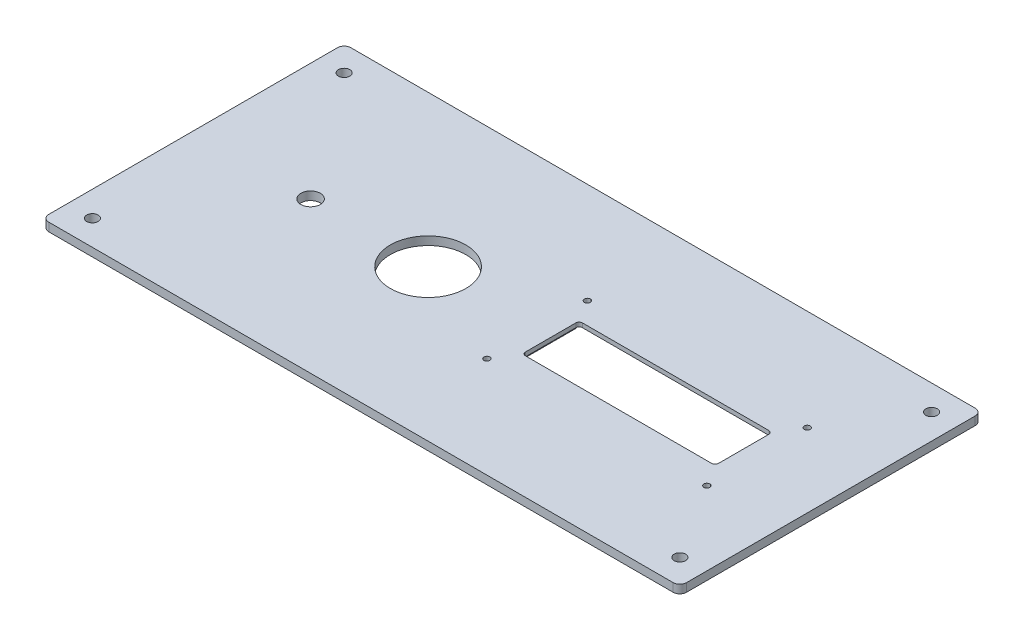
ISO-10303-21;
HEADER;
FILE_DESCRIPTION(('STEP AP214'),'2;1');
FILE_NAME('part.step','',(''),(''),'','','');
FILE_SCHEMA(('AUTOMOTIVE_DESIGN { 1 0 10303 214 1 1 1 1 }'));
ENDSEC;
DATA;
#1=APPLICATION_CONTEXT('core data for automotive mechanical design processes');
#2=APPLICATION_PROTOCOL_DEFINITION('international standard','automotive_design',2000,#1);
#3=PRODUCT_CONTEXT('',#1,'mechanical');
#4=PRODUCT('Part','Part','',(#3));
#5=PRODUCT_RELATED_PRODUCT_CATEGORY('part','',(#4));
#6=PRODUCT_DEFINITION_FORMATION('','',#4);
#7=PRODUCT_DEFINITION_CONTEXT('part definition',#1,'design');
#8=PRODUCT_DEFINITION('design','',#6,#7);
#9=PRODUCT_DEFINITION_SHAPE('','',#8);
#10=(LENGTH_UNIT() NAMED_UNIT(*) SI_UNIT(.MILLI.,.METRE.));
#11=(NAMED_UNIT(*) PLANE_ANGLE_UNIT() SI_UNIT($,.RADIAN.));
#12=(NAMED_UNIT(*) SI_UNIT($,.STERADIAN.) SOLID_ANGLE_UNIT());
#13=UNCERTAINTY_MEASURE_WITH_UNIT(LENGTH_MEASURE(1.E-05),#10,'distance_accuracy_value','');
#14=(GEOMETRIC_REPRESENTATION_CONTEXT(3) GLOBAL_UNCERTAINTY_ASSIGNED_CONTEXT((#13)) GLOBAL_UNIT_ASSIGNED_CONTEXT((#10,
#11,#12)) REPRESENTATION_CONTEXT('',''));
#15=CARTESIAN_POINT('',(0.,0.,0.));
#16=DIRECTION('',(0.,0.,1.));
#17=DIRECTION('',(1.,0.,0.));
#18=AXIS2_PLACEMENT_3D('',#15,#16,#17);
#19=CARTESIAN_POINT('',(87.63,3.175,10.795));
#20=DIRECTION('',(-1.,0.,0.));
#21=DIRECTION('',(0.,0.,1.));
#22=AXIS2_PLACEMENT_3D('',#19,#20,#21);
#23=PLANE('',#22);
#24=DIRECTION('',(0.,-1.,0.));
#25=VECTOR('',#24,1.);
#26=CARTESIAN_POINT('',(87.63,0.,-9.52500000000001));
#27=LINE('',#26,#25);
#28=CARTESIAN_POINT('',(87.63,3.175,-9.52500000000001));
#29=VERTEX_POINT('',#28);
#30=CARTESIAN_POINT('',(87.63,1.5875,-9.52500000000001));
#31=VERTEX_POINT('',#30);
#32=EDGE_CURVE('E374',#29,#31,#27,.T.);
#33=ORIENTED_EDGE('',*,*,#32,.T.);
#34=DIRECTION('',(0.,0.,-1.));
#35=VECTOR('',#34,1.);
#36=CARTESIAN_POINT('',(87.63,1.5875,0.));
#37=LINE('',#36,#35);
#38=CARTESIAN_POINT('',(87.63,1.5875,9.52499999999998));
#39=VERTEX_POINT('',#38);
#40=EDGE_CURVE('E241',#39,#31,#37,.T.);
#41=ORIENTED_EDGE('',*,*,#40,.F.);
#42=DIRECTION('',(0.,-1.,0.));
#43=VECTOR('',#42,1.);
#44=CARTESIAN_POINT('',(87.63,3.175,9.52499999999998));
#45=LINE('',#44,#43);
#46=CARTESIAN_POINT('',(87.63,3.175,9.52499999999998));
#47=VERTEX_POINT('',#46);
#48=EDGE_CURVE('E362',#39,#47,#45,.F.);
#49=ORIENTED_EDGE('',*,*,#48,.T.);
#50=DIRECTION('',(0.,0.,-1.));
#51=VECTOR('',#50,1.);
#52=CARTESIAN_POINT('',(87.63,3.175,10.795));
#53=LINE('',#52,#51);
#54=EDGE_CURVE('E298',#47,#29,#53,.T.);
#55=ORIENTED_EDGE('',*,*,#54,.T.);
#56=EDGE_LOOP('',(#33,#41,#49,#55));
#57=FACE_BOUND('',#56,.T.);
#58=ADVANCED_FACE('F33',(#57),#23,.T.);
#59=CARTESIAN_POINT('',(14.605,3.175,-10.795));
#60=DIRECTION('',(0.,0.,1.));
#61=DIRECTION('',(1.,0.,0.));
#62=AXIS2_PLACEMENT_3D('',#59,#60,#61);
#63=PLANE('',#62);
#64=DIRECTION('',(0.,-1.,0.));
#65=VECTOR('',#64,1.);
#66=CARTESIAN_POINT('',(15.875,0.,-10.795));
#67=LINE('',#66,#65);
#68=CARTESIAN_POINT('',(15.875,3.175,-10.795));
#69=VERTEX_POINT('',#68);
#70=CARTESIAN_POINT('',(15.875,1.5875,-10.795));
#71=VERTEX_POINT('',#70);
#72=EDGE_CURVE('E377',#69,#71,#67,.T.);
#73=ORIENTED_EDGE('',*,*,#72,.T.);
#74=DIRECTION('',(-1.,0.,0.));
#75=VECTOR('',#74,1.);
#76=CARTESIAN_POINT('',(0.,1.5875,-10.795));
#77=LINE('',#76,#75);
#78=CARTESIAN_POINT('',(86.36,1.5875,-10.795));
#79=VERTEX_POINT('',#78);
#80=EDGE_CURVE('E56',#79,#71,#77,.T.);
#81=ORIENTED_EDGE('',*,*,#80,.F.);
#82=DIRECTION('',(0.,-1.,0.));
#83=VECTOR('',#82,1.);
#84=CARTESIAN_POINT('',(86.36,3.175,-10.795));
#85=LINE('',#84,#83);
#86=CARTESIAN_POINT('',(86.36,3.175,-10.795));
#87=VERTEX_POINT('',#86);
#88=EDGE_CURVE('E380',#79,#87,#85,.F.);
#89=ORIENTED_EDGE('',*,*,#88,.T.);
#90=DIRECTION('',(-1.,0.,0.));
#91=VECTOR('',#90,1.);
#92=CARTESIAN_POINT('',(14.605,3.175,-10.795));
#93=LINE('',#92,#91);
#94=EDGE_CURVE('E303',#87,#69,#93,.T.);
#95=ORIENTED_EDGE('',*,*,#94,.T.);
#96=EDGE_LOOP('',(#73,#81,#89,#95));
#97=FACE_BOUND('',#96,.T.);
#98=ADVANCED_FACE('F481',(#97),#63,.T.);
#99=CARTESIAN_POINT('',(14.605,3.175,10.795));
#100=DIRECTION('',(1.,0.,0.));
#101=DIRECTION('',(0.,0.,-1.));
#102=AXIS2_PLACEMENT_3D('',#99,#100,#101);
#103=PLANE('',#102);
#104=DIRECTION('',(0.,-1.,0.));
#105=VECTOR('',#104,1.);
#106=CARTESIAN_POINT('',(14.605,0.,9.52499999999998));
#107=LINE('',#106,#105);
#108=CARTESIAN_POINT('',(14.605,3.175,9.52499999999998));
#109=VERTEX_POINT('',#108);
#110=CARTESIAN_POINT('',(14.605,1.5875,9.52499999999998));
#111=VERTEX_POINT('',#110);
#112=EDGE_CURVE('E389',#109,#111,#107,.T.);
#113=ORIENTED_EDGE('',*,*,#112,.T.);
#114=DIRECTION('',(0.,0.,1.));
#115=VECTOR('',#114,1.);
#116=CARTESIAN_POINT('',(14.605,1.5875,0.));
#117=LINE('',#116,#115);
#118=CARTESIAN_POINT('',(14.605,1.5875,-9.52500000000001));
#119=VERTEX_POINT('',#118);
#120=EDGE_CURVE('E233',#119,#111,#117,.T.);
#121=ORIENTED_EDGE('',*,*,#120,.F.);
#122=DIRECTION('',(0.,-1.,0.));
#123=VECTOR('',#122,1.);
#124=CARTESIAN_POINT('',(14.605,3.175,-9.52500000000001));
#125=LINE('',#124,#123);
#126=CARTESIAN_POINT('',(14.605,3.175,-9.52500000000001));
#127=VERTEX_POINT('',#126);
#128=EDGE_CURVE('E387',#119,#127,#125,.F.);
#129=ORIENTED_EDGE('',*,*,#128,.T.);
#130=DIRECTION('',(0.,0.,1.));
#131=VECTOR('',#130,1.);
#132=CARTESIAN_POINT('',(14.605,3.175,10.795));
#133=LINE('',#132,#131);
#134=EDGE_CURVE('E306',#127,#109,#133,.T.);
#135=ORIENTED_EDGE('',*,*,#134,.T.);
#136=EDGE_LOOP('',(#113,#121,#129,#135));
#137=FACE_BOUND('',#136,.T.);
#138=ADVANCED_FACE('F487',(#137),#103,.T.);
#139=CARTESIAN_POINT('',(14.605,3.175,10.795));
#140=DIRECTION('',(0.,0.,-1.));
#141=DIRECTION('',(-1.,0.,0.));
#142=AXIS2_PLACEMENT_3D('',#139,#140,#141);
#143=PLANE('',#142);
#144=DIRECTION('',(0.,-1.,0.));
#145=VECTOR('',#144,1.);
#146=CARTESIAN_POINT('',(86.36,0.,10.795));
#147=LINE('',#146,#145);
#148=CARTESIAN_POINT('',(86.36,3.175,10.795));
#149=VERTEX_POINT('',#148);
#150=CARTESIAN_POINT('',(86.36,1.5875,10.795));
#151=VERTEX_POINT('',#150);
#152=EDGE_CURVE('E384',#149,#151,#147,.T.);
#153=ORIENTED_EDGE('',*,*,#152,.T.);
#154=DIRECTION('',(1.,0.,0.));
#155=VECTOR('',#154,1.);
#156=CARTESIAN_POINT('',(0.,1.5875,10.795));
#157=LINE('',#156,#155);
#158=CARTESIAN_POINT('',(15.875,1.5875,10.795));
#159=VERTEX_POINT('',#158);
#160=EDGE_CURVE('E237',#159,#151,#157,.T.);
#161=ORIENTED_EDGE('',*,*,#160,.F.);
#162=DIRECTION('',(0.,-1.,0.));
#163=VECTOR('',#162,1.);
#164=CARTESIAN_POINT('',(15.875,3.175,10.795));
#165=LINE('',#164,#163);
#166=CARTESIAN_POINT('',(15.875,3.175,10.795));
#167=VERTEX_POINT('',#166);
#168=EDGE_CURVE('E382',#159,#167,#165,.F.);
#169=ORIENTED_EDGE('',*,*,#168,.T.);
#170=DIRECTION('',(1.,0.,0.));
#171=VECTOR('',#170,1.);
#172=CARTESIAN_POINT('',(14.605,3.175,10.795));
#173=LINE('',#172,#171);
#174=EDGE_CURVE('E309',#167,#149,#173,.T.);
#175=ORIENTED_EDGE('',*,*,#174,.T.);
#176=EDGE_LOOP('',(#153,#161,#169,#175));
#177=FACE_BOUND('',#176,.T.);
#178=ADVANCED_FACE('F536',(#177),#143,.T.);
#179=CARTESIAN_POINT('',(86.36,3.175,-9.52500000000001));
#180=DIRECTION('',(0.,1.,0.));
#181=DIRECTION('',(0.,0.,1.));
#182=AXIS2_PLACEMENT_3D('',#179,#180,#181);
#183=CYLINDRICAL_SURFACE('',#182,1.27);
#184=CARTESIAN_POINT('',(86.36,1.5875,-9.52500000000001));
#185=DIRECTION('',(0.,-1.,0.));
#186=DIRECTION('',(0.,0.,-1.));
#187=AXIS2_PLACEMENT_3D('',#184,#185,#186);
#188=CIRCLE('',#187,1.27);
#189=EDGE_CURVE('E243',#31,#79,#188,.F.);
#190=ORIENTED_EDGE('',*,*,#189,.F.);
#191=ORIENTED_EDGE('',*,*,#32,.F.);
#192=CARTESIAN_POINT('',(86.36,3.175,-9.52500000000001));
#193=DIRECTION('',(0.,-1.,0.));
#194=DIRECTION('',(0.,0.,-1.));
#195=AXIS2_PLACEMENT_3D('',#192,#193,#194);
#196=CIRCLE('',#195,1.27);
#197=EDGE_CURVE('E392',#87,#29,#196,.T.);
#198=ORIENTED_EDGE('',*,*,#197,.F.);
#199=ORIENTED_EDGE('',*,*,#88,.F.);
#200=EDGE_LOOP('',(#190,#191,#198,#199));
#201=FACE_BOUND('',#200,.T.);
#202=ADVANCED_FACE('F532',(#201),#183,.F.);
#203=CARTESIAN_POINT('',(86.36,3.175,9.52499999999998));
#204=DIRECTION('',(0.,1.,0.));
#205=DIRECTION('',(0.,0.,1.));
#206=AXIS2_PLACEMENT_3D('',#203,#204,#205);
#207=CYLINDRICAL_SURFACE('',#206,1.27);
#208=CARTESIAN_POINT('',(86.36,1.5875,9.52499999999998));
#209=DIRECTION('',(0.,-1.,0.));
#210=DIRECTION('',(0.,0.,-1.));
#211=AXIS2_PLACEMENT_3D('',#208,#209,#210);
#212=CIRCLE('',#211,1.27);
#213=EDGE_CURVE('E239',#151,#39,#212,.F.);
#214=ORIENTED_EDGE('',*,*,#213,.F.);
#215=ORIENTED_EDGE('',*,*,#152,.F.);
#216=CARTESIAN_POINT('',(86.36,3.175,9.52499999999998));
#217=DIRECTION('',(0.,-1.,0.));
#218=DIRECTION('',(0.,0.,-1.));
#219=AXIS2_PLACEMENT_3D('',#216,#217,#218);
#220=CIRCLE('',#219,1.27);
#221=EDGE_CURVE('E394',#47,#149,#220,.T.);
#222=ORIENTED_EDGE('',*,*,#221,.F.);
#223=ORIENTED_EDGE('',*,*,#48,.F.);
#224=EDGE_LOOP('',(#214,#215,#222,#223));
#225=FACE_BOUND('',#224,.T.);
#226=ADVANCED_FACE('F535',(#225),#207,.F.);
#227=CARTESIAN_POINT('',(15.875,3.175,9.52499999999998));
#228=DIRECTION('',(0.,1.,0.));
#229=DIRECTION('',(0.,0.,1.));
#230=AXIS2_PLACEMENT_3D('',#227,#228,#229);
#231=CYLINDRICAL_SURFACE('',#230,1.27);
#232=CARTESIAN_POINT('',(15.875,1.5875,9.52499999999998));
#233=DIRECTION('',(0.,-1.,0.));
#234=DIRECTION('',(0.,0.,-1.));
#235=AXIS2_PLACEMENT_3D('',#232,#233,#234);
#236=CIRCLE('',#235,1.27);
#237=EDGE_CURVE('E235',#111,#159,#236,.F.);
#238=ORIENTED_EDGE('',*,*,#237,.F.);
#239=ORIENTED_EDGE('',*,*,#112,.F.);
#240=CARTESIAN_POINT('',(15.875,3.175,9.52499999999998));
#241=DIRECTION('',(0.,-1.,0.));
#242=DIRECTION('',(0.,0.,-1.));
#243=AXIS2_PLACEMENT_3D('',#240,#241,#242);
#244=CIRCLE('',#243,1.27);
#245=EDGE_CURVE('E396',#167,#109,#244,.T.);
#246=ORIENTED_EDGE('',*,*,#245,.F.);
#247=ORIENTED_EDGE('',*,*,#168,.F.);
#248=EDGE_LOOP('',(#238,#239,#246,#247));
#249=FACE_BOUND('',#248,.T.);
#250=ADVANCED_FACE('F540',(#249),#231,.F.);
#251=CARTESIAN_POINT('',(15.875,3.175,-9.52500000000001));
#252=DIRECTION('',(0.,1.,0.));
#253=DIRECTION('',(0.,0.,1.));
#254=AXIS2_PLACEMENT_3D('',#251,#252,#253);
#255=CYLINDRICAL_SURFACE('',#254,1.27);
#256=CARTESIAN_POINT('',(15.875,1.5875,-9.52500000000001));
#257=DIRECTION('',(0.,-1.,0.));
#258=DIRECTION('',(0.,0.,-1.));
#259=AXIS2_PLACEMENT_3D('',#256,#257,#258);
#260=CIRCLE('',#259,1.27);
#261=EDGE_CURVE('E231',#71,#119,#260,.F.);
#262=ORIENTED_EDGE('',*,*,#261,.F.);
#263=ORIENTED_EDGE('',*,*,#72,.F.);
#264=CARTESIAN_POINT('',(15.875,3.175,-9.52500000000001));
#265=DIRECTION('',(0.,-1.,0.));
#266=DIRECTION('',(0.,0.,-1.));
#267=AXIS2_PLACEMENT_3D('',#264,#265,#266);
#268=CIRCLE('',#267,1.27);
#269=EDGE_CURVE('E398',#127,#69,#268,.T.);
#270=ORIENTED_EDGE('',*,*,#269,.F.);
#271=ORIENTED_EDGE('',*,*,#128,.F.);
#272=EDGE_LOOP('',(#262,#263,#270,#271));
#273=FACE_BOUND('',#272,.T.);
#274=ADVANCED_FACE('F519',(#273),#255,.F.);
#275=CARTESIAN_POINT('',(0.,3.175,0.));
#276=DIRECTION('',(0.,-1.,0.));
#277=DIRECTION('',(0.,0.,-1.));
#278=AXIS2_PLACEMENT_3D('',#275,#276,#277);
#279=PLANE('',#278);
#280=CARTESIAN_POINT('',(92.7175000000001,3.175,19.));
#281=DIRECTION('',(0.,1.,0.));
#282=DIRECTION('',(0.,0.,1.));
#283=AXIS2_PLACEMENT_3D('',#280,#281,#282);
#284=CIRCLE('',#283,1.1303);
#285=CARTESIAN_POINT('',(92.7175000000001,3.175,20.1303));
#286=VERTEX_POINT('',#285);
#287=EDGE_CURVE('E283',#286,#286,#284,.T.);
#288=ORIENTED_EDGE('',*,*,#287,.F.);
#289=EDGE_LOOP('',(#288));
#290=FACE_BOUND('',#289,.T.);
#291=CARTESIAN_POINT('',(9.51749999999999,3.175,-19.));
#292=DIRECTION('',(0.,1.,0.));
#293=DIRECTION('',(0.,0.,1.));
#294=AXIS2_PLACEMENT_3D('',#291,#292,#293);
#295=CIRCLE('',#294,1.1303);
#296=CARTESIAN_POINT('',(9.51749999999999,3.175,-17.8697));
#297=VERTEX_POINT('',#296);
#298=EDGE_CURVE('E295',#297,#297,#295,.T.);
#299=ORIENTED_EDGE('',*,*,#298,.F.);
#300=EDGE_LOOP('',(#299));
#301=FACE_BOUND('',#300,.T.);
#302=CARTESIAN_POINT('',(-31.75,3.175,0.));
#303=DIRECTION('',(0.,1.,0.));
#304=DIRECTION('',(0.,0.,1.));
#305=AXIS2_PLACEMENT_3D('',#302,#303,#304);
#306=CIRCLE('',#305,14.2875);
#307=CARTESIAN_POINT('',(-31.75,3.175,14.2875));
#308=VERTEX_POINT('',#307);
#309=EDGE_CURVE('E313',#308,#308,#306,.T.);
#310=ORIENTED_EDGE('',*,*,#309,.F.);
#311=EDGE_LOOP('',(#310));
#312=FACE_BOUND('',#311,.T.);
#313=CARTESIAN_POINT('',(-111.125,3.175,47.625));
#314=DIRECTION('',(0.,1.,0.));
#315=DIRECTION('',(0.,0.,-1.));
#316=AXIS2_PLACEMENT_3D('',#313,#314,#315);
#317=CIRCLE('',#316,2.15899999999999);
#318=CARTESIAN_POINT('',(-111.125,3.175,45.466));
#319=VERTEX_POINT('',#318);
#320=EDGE_CURVE('E325',#319,#319,#317,.T.);
#321=ORIENTED_EDGE('',*,*,#320,.F.);
#322=EDGE_LOOP('',(#321));
#323=FACE_BOUND('',#322,.T.);
#324=CARTESIAN_POINT('',(111.125,3.175,-47.625));
#325=DIRECTION('',(0.,1.,0.));
#326=DIRECTION('',(0.,0.,-1.));
#327=AXIS2_PLACEMENT_3D('',#324,#325,#326);
#328=CIRCLE('',#327,2.15899999999999);
#329=CARTESIAN_POINT('',(111.125,3.175,-49.784));
#330=VERTEX_POINT('',#329);
#331=EDGE_CURVE('E337',#330,#330,#328,.T.);
#332=ORIENTED_EDGE('',*,*,#331,.F.);
#333=EDGE_LOOP('',(#332));
#334=FACE_BOUND('',#333,.T.);
#335=DIRECTION('',(-1.,0.,0.));
#336=VECTOR('',#335,1.);
#337=CARTESIAN_POINT('',(-120.65,3.175,-57.15));
#338=LINE('',#337,#336);
#339=CARTESIAN_POINT('',(118.11,3.175,-57.15));
#340=VERTEX_POINT('',#339);
#341=CARTESIAN_POINT('',(-118.11,3.175,-57.15));
#342=VERTEX_POINT('',#341);
#343=EDGE_CURVE('E352',#340,#342,#338,.T.);
#344=ORIENTED_EDGE('',*,*,#343,.T.);
#345=CARTESIAN_POINT('',(-118.11,3.175,-54.61));
#346=DIRECTION('',(0.,-1.,0.));
#347=DIRECTION('',(0.,0.,-1.));
#348=AXIS2_PLACEMENT_3D('',#345,#346,#347);
#349=CIRCLE('',#348,2.54);
#350=CARTESIAN_POINT('',(-120.65,3.175,-54.61));
#351=VERTEX_POINT('',#350);
#352=EDGE_CURVE('E424',#342,#351,#349,.F.);
#353=ORIENTED_EDGE('',*,*,#352,.T.);
#354=DIRECTION('',(0.,0.,1.));
#355=VECTOR('',#354,1.);
#356=CARTESIAN_POINT('',(-120.65,3.175,57.15));
#357=LINE('',#356,#355);
#358=CARTESIAN_POINT('',(-120.65,3.175,54.61));
#359=VERTEX_POINT('',#358);
#360=EDGE_CURVE('E356',#351,#359,#357,.T.);
#361=ORIENTED_EDGE('',*,*,#360,.T.);
#362=CARTESIAN_POINT('',(-118.11,3.175,54.61));
#363=DIRECTION('',(0.,-1.,0.));
#364=DIRECTION('',(0.,0.,-1.));
#365=AXIS2_PLACEMENT_3D('',#362,#363,#364);
#366=CIRCLE('',#365,2.54);
#367=CARTESIAN_POINT('',(-118.11,3.175,57.15));
#368=VERTEX_POINT('',#367);
#369=EDGE_CURVE('E422',#359,#368,#366,.F.);
#370=ORIENTED_EDGE('',*,*,#369,.T.);
#371=DIRECTION('',(1.,0.,0.));
#372=VECTOR('',#371,1.);
#373=CARTESIAN_POINT('',(-120.65,3.175,57.15));
#374=LINE('',#373,#372);
#375=CARTESIAN_POINT('',(118.11,3.175,57.15));
#376=VERTEX_POINT('',#375);
#377=EDGE_CURVE('E359',#368,#376,#374,.T.);
#378=ORIENTED_EDGE('',*,*,#377,.T.);
#379=CARTESIAN_POINT('',(118.11,3.175,54.61));
#380=DIRECTION('',(0.,-1.,0.));
#381=DIRECTION('',(0.,0.,-1.));
#382=AXIS2_PLACEMENT_3D('',#379,#380,#381);
#383=CIRCLE('',#382,2.54);
#384=CARTESIAN_POINT('',(120.65,3.175,54.61));
#385=VERTEX_POINT('',#384);
#386=EDGE_CURVE('E418',#376,#385,#383,.F.);
#387=ORIENTED_EDGE('',*,*,#386,.T.);
#388=DIRECTION('',(0.,0.,-1.));
#389=VECTOR('',#388,1.);
#390=CARTESIAN_POINT('',(120.65,3.175,57.15));
#391=LINE('',#390,#389);
#392=CARTESIAN_POINT('',(120.65,3.175,-54.61));
#393=VERTEX_POINT('',#392);
#394=EDGE_CURVE('E349',#385,#393,#391,.T.);
#395=ORIENTED_EDGE('',*,*,#394,.T.);
#396=CARTESIAN_POINT('',(118.11,3.175,-54.61));
#397=DIRECTION('',(0.,-1.,0.));
#398=DIRECTION('',(0.,0.,-1.));
#399=AXIS2_PLACEMENT_3D('',#396,#397,#398);
#400=CIRCLE('',#399,2.54);
#401=EDGE_CURVE('E420',#393,#340,#400,.F.);
#402=ORIENTED_EDGE('',*,*,#401,.T.);
#403=EDGE_LOOP('',(#344,#353,#361,#370,#378,#387,#395,#402));
#404=FACE_BOUND('',#403,.T.);
#405=CARTESIAN_POINT('',(-111.125,3.175,-47.625));
#406=DIRECTION('',(0.,1.,0.));
#407=DIRECTION('',(0.,0.,1.));
#408=AXIS2_PLACEMENT_3D('',#405,#406,#407);
#409=CIRCLE('',#408,2.15899999999999);
#410=CARTESIAN_POINT('',(-111.125,3.175,-45.466));
#411=VERTEX_POINT('',#410);
#412=EDGE_CURVE('E343',#411,#411,#409,.T.);
#413=ORIENTED_EDGE('',*,*,#412,.F.);
#414=EDGE_LOOP('',(#413));
#415=FACE_BOUND('',#414,.T.);
#416=CARTESIAN_POINT('',(111.125,3.175,47.625));
#417=DIRECTION('',(0.,1.,0.));
#418=DIRECTION('',(0.,0.,1.));
#419=AXIS2_PLACEMENT_3D('',#416,#417,#418);
#420=CIRCLE('',#419,2.15899999999999);
#421=CARTESIAN_POINT('',(111.125,3.175,49.784));
#422=VERTEX_POINT('',#421);
#423=EDGE_CURVE('E331',#422,#422,#420,.T.);
#424=ORIENTED_EDGE('',*,*,#423,.F.);
#425=EDGE_LOOP('',(#424));
#426=FACE_BOUND('',#425,.T.);
#427=CARTESIAN_POINT('',(-76.2,3.175,0.));
#428=DIRECTION('',(0.,1.,0.));
#429=DIRECTION('',(0.,0.,1.));
#430=AXIS2_PLACEMENT_3D('',#427,#428,#429);
#431=CIRCLE('',#430,3.683);
#432=CARTESIAN_POINT('',(-76.2,3.175,3.683));
#433=VERTEX_POINT('',#432);
#434=EDGE_CURVE('E319',#433,#433,#431,.T.);
#435=ORIENTED_EDGE('',*,*,#434,.F.);
#436=EDGE_LOOP('',(#435));
#437=FACE_BOUND('',#436,.T.);
#438=ORIENTED_EDGE('',*,*,#54,.F.);
#439=ORIENTED_EDGE('',*,*,#221,.T.);
#440=ORIENTED_EDGE('',*,*,#174,.F.);
#441=ORIENTED_EDGE('',*,*,#245,.T.);
#442=ORIENTED_EDGE('',*,*,#134,.F.);
#443=ORIENTED_EDGE('',*,*,#269,.T.);
#444=ORIENTED_EDGE('',*,*,#94,.F.);
#445=ORIENTED_EDGE('',*,*,#197,.T.);
#446=EDGE_LOOP('',(#438,#439,#440,#441,#442,#443,#444,#445));
#447=FACE_BOUND('',#446,.T.);
#448=CARTESIAN_POINT('',(9.51749999999988,3.175,19.));
#449=DIRECTION('',(0.,1.,0.));
#450=DIRECTION('',(0.,0.,-1.));
#451=AXIS2_PLACEMENT_3D('',#448,#449,#450);
#452=CIRCLE('',#451,1.1303);
#453=CARTESIAN_POINT('',(9.51749999999988,3.175,17.8697));
#454=VERTEX_POINT('',#453);
#455=EDGE_CURVE('E289',#454,#454,#452,.T.);
#456=ORIENTED_EDGE('',*,*,#455,.F.);
#457=EDGE_LOOP('',(#456));
#458=FACE_BOUND('',#457,.T.);
#459=CARTESIAN_POINT('',(92.7175,3.175,-19.));
#460=DIRECTION('',(0.,1.,0.));
#461=DIRECTION('',(0.,0.,-1.));
#462=AXIS2_PLACEMENT_3D('',#459,#460,#461);
#463=CIRCLE('',#462,1.1303);
#464=CARTESIAN_POINT('',(92.7175,3.175,-20.1303));
#465=VERTEX_POINT('',#464);
#466=EDGE_CURVE('E277',#465,#465,#463,.T.);
#467=ORIENTED_EDGE('',*,*,#466,.F.);
#468=EDGE_LOOP('',(#467));
#469=FACE_BOUND('',#468,.T.);
#470=ADVANCED_FACE('F455',(#290,#301,#312,#323,#334,#404,#415,#426,#437,#447,#458,#469),#279,.F.);
#471=CARTESIAN_POINT('',(0.,0.,0.));
#472=DIRECTION('',(0.,-1.,0.));
#473=DIRECTION('',(0.,0.,-1.));
#474=AXIS2_PLACEMENT_3D('',#471,#472,#473);
#475=PLANE('',#474);
#476=CARTESIAN_POINT('',(88.9635,0.,12.573));
#477=DIRECTION('',(0.,-1.,0.));
#478=DIRECTION('',(0.,0.,-1.));
#479=AXIS2_PLACEMENT_3D('',#476,#477,#478);
#480=CIRCLE('',#479,1.5875);
#481=CARTESIAN_POINT('',(88.9635,0.,10.9855));
#482=VERTEX_POINT('',#481);
#483=CARTESIAN_POINT('',(87.376,0.,12.573));
#484=VERTEX_POINT('',#483);
#485=EDGE_CURVE('E48',#482,#484,#480,.T.);
#486=ORIENTED_EDGE('',*,*,#485,.F.);
#487=DIRECTION('',(0.,0.,-1.));
#488=VECTOR('',#487,1.);
#489=CARTESIAN_POINT('',(88.9635,0.,0.));
#490=LINE('',#489,#488);
#491=CARTESIAN_POINT('',(88.9635,0.,-10.9855));
#492=VERTEX_POINT('',#491);
#493=EDGE_CURVE('E213',#482,#492,#490,.T.);
#494=ORIENTED_EDGE('',*,*,#493,.T.);
#495=CARTESIAN_POINT('',(88.9635,0.,-12.573));
#496=DIRECTION('',(0.,-1.,0.));
#497=DIRECTION('',(0.,0.,-1.));
#498=AXIS2_PLACEMENT_3D('',#495,#496,#497);
#499=CIRCLE('',#498,1.5875);
#500=CARTESIAN_POINT('',(87.376,0.,-12.573));
#501=VERTEX_POINT('',#500);
#502=EDGE_CURVE('E216',#501,#492,#499,.T.);
#503=ORIENTED_EDGE('',*,*,#502,.F.);
#504=DIRECTION('',(-1.,0.,0.));
#505=VECTOR('',#504,1.);
#506=CARTESIAN_POINT('',(0.,0.,-12.573));
#507=LINE('',#506,#505);
#508=CARTESIAN_POINT('',(14.859,0.,-12.573));
#509=VERTEX_POINT('',#508);
#510=EDGE_CURVE('E258',#501,#509,#507,.T.);
#511=ORIENTED_EDGE('',*,*,#510,.T.);
#512=CARTESIAN_POINT('',(13.2715,0.,-12.573));
#513=DIRECTION('',(0.,-1.,0.));
#514=DIRECTION('',(0.,0.,-1.));
#515=AXIS2_PLACEMENT_3D('',#512,#513,#514);
#516=CIRCLE('',#515,1.5875);
#517=CARTESIAN_POINT('',(13.2715,0.,-10.9855));
#518=VERTEX_POINT('',#517);
#519=EDGE_CURVE('E255',#518,#509,#516,.T.);
#520=ORIENTED_EDGE('',*,*,#519,.F.);
#521=DIRECTION('',(0.,0.,-1.));
#522=VECTOR('',#521,1.);
#523=CARTESIAN_POINT('',(13.2715,0.,0.));
#524=LINE('',#523,#522);
#525=CARTESIAN_POINT('',(13.2715,0.,10.9855));
#526=VERTEX_POINT('',#525);
#527=EDGE_CURVE('E252',#526,#518,#524,.T.);
#528=ORIENTED_EDGE('',*,*,#527,.F.);
#529=CARTESIAN_POINT('',(13.2715,0.,12.573));
#530=DIRECTION('',(0.,-1.,0.));
#531=DIRECTION('',(0.,0.,-1.));
#532=AXIS2_PLACEMENT_3D('',#529,#530,#531);
#533=CIRCLE('',#532,1.5875);
#534=CARTESIAN_POINT('',(14.859,0.,12.573));
#535=VERTEX_POINT('',#534);
#536=EDGE_CURVE('E249',#535,#526,#533,.T.);
#537=ORIENTED_EDGE('',*,*,#536,.F.);
#538=DIRECTION('',(-1.,0.,0.));
#539=VECTOR('',#538,1.);
#540=CARTESIAN_POINT('',(0.,0.,12.573));
#541=LINE('',#540,#539);
#542=EDGE_CURVE('E247',#484,#535,#541,.T.);
#543=ORIENTED_EDGE('',*,*,#542,.F.);
#544=EDGE_LOOP('',(#486,#494,#503,#511,#520,#528,#537,#543));
#545=FACE_BOUND('',#544,.T.);
#546=CARTESIAN_POINT('',(92.7175000000001,0.,19.));
#547=DIRECTION('',(0.,1.,0.));
#548=DIRECTION('',(0.,0.,1.));
#549=AXIS2_PLACEMENT_3D('',#546,#547,#548);
#550=CIRCLE('',#549,1.1303);
#551=CARTESIAN_POINT('',(92.7175000000001,0.,20.1303));
#552=VERTEX_POINT('',#551);
#553=EDGE_CURVE('E280',#552,#552,#550,.T.);
#554=ORIENTED_EDGE('',*,*,#553,.T.);
#555=EDGE_LOOP('',(#554));
#556=FACE_BOUND('',#555,.T.);
#557=CARTESIAN_POINT('',(9.51749999999999,0.,-19.));
#558=DIRECTION('',(0.,1.,0.));
#559=DIRECTION('',(0.,0.,1.));
#560=AXIS2_PLACEMENT_3D('',#557,#558,#559);
#561=CIRCLE('',#560,1.1303);
#562=CARTESIAN_POINT('',(9.51749999999999,0.,-17.8697));
#563=VERTEX_POINT('',#562);
#564=EDGE_CURVE('E292',#563,#563,#561,.T.);
#565=ORIENTED_EDGE('',*,*,#564,.T.);
#566=EDGE_LOOP('',(#565));
#567=FACE_BOUND('',#566,.T.);
#568=CARTESIAN_POINT('',(-31.75,0.,0.));
#569=DIRECTION('',(0.,1.,0.));
#570=DIRECTION('',(0.,0.,1.));
#571=AXIS2_PLACEMENT_3D('',#568,#569,#570);
#572=CIRCLE('',#571,14.2875);
#573=CARTESIAN_POINT('',(-31.75,0.,14.2875));
#574=VERTEX_POINT('',#573);
#575=EDGE_CURVE('E312',#574,#574,#572,.T.);
#576=ORIENTED_EDGE('',*,*,#575,.T.);
#577=EDGE_LOOP('',(#576));
#578=FACE_BOUND('',#577,.T.);
#579=CARTESIAN_POINT('',(-111.125,0.,47.625));
#580=DIRECTION('',(0.,1.,0.));
#581=DIRECTION('',(0.,0.,-1.));
#582=AXIS2_PLACEMENT_3D('',#579,#580,#581);
#583=CIRCLE('',#582,2.15899999999999);
#584=CARTESIAN_POINT('',(-111.125,0.,45.466));
#585=VERTEX_POINT('',#584);
#586=EDGE_CURVE('E322',#585,#585,#583,.T.);
#587=ORIENTED_EDGE('',*,*,#586,.T.);
#588=EDGE_LOOP('',(#587));
#589=FACE_BOUND('',#588,.T.);
#590=CARTESIAN_POINT('',(111.125,0.,-47.625));
#591=DIRECTION('',(0.,1.,0.));
#592=DIRECTION('',(0.,0.,-1.));
#593=AXIS2_PLACEMENT_3D('',#590,#591,#592);
#594=CIRCLE('',#593,2.15899999999999);
#595=CARTESIAN_POINT('',(111.125,0.,-49.784));
#596=VERTEX_POINT('',#595);
#597=EDGE_CURVE('E334',#596,#596,#594,.T.);
#598=ORIENTED_EDGE('',*,*,#597,.T.);
#599=EDGE_LOOP('',(#598));
#600=FACE_BOUND('',#599,.T.);
#601=DIRECTION('',(0.,0.,1.));
#602=VECTOR('',#601,1.);
#603=CARTESIAN_POINT('',(-120.65,0.,57.15));
#604=LINE('',#603,#602);
#605=CARTESIAN_POINT('',(-120.65,0.,-54.61));
#606=VERTEX_POINT('',#605);
#607=CARTESIAN_POINT('',(-120.65,0.,54.61));
#608=VERTEX_POINT('',#607);
#609=EDGE_CURVE('E368',#606,#608,#604,.T.);
#610=ORIENTED_EDGE('',*,*,#609,.F.);
#611=CARTESIAN_POINT('',(-118.11,0.,-54.61));
#612=DIRECTION('',(0.,-1.,0.));
#613=DIRECTION('',(0.,0.,-1.));
#614=AXIS2_PLACEMENT_3D('',#611,#612,#613);
#615=CIRCLE('',#614,2.54);
#616=CARTESIAN_POINT('',(-118.11,0.,-57.15));
#617=VERTEX_POINT('',#616);
#618=EDGE_CURVE('E411',#606,#617,#615,.T.);
#619=ORIENTED_EDGE('',*,*,#618,.T.);
#620=DIRECTION('',(-1.,0.,0.));
#621=VECTOR('',#620,1.);
#622=CARTESIAN_POINT('',(-120.65,0.,-57.15));
#623=LINE('',#622,#621);
#624=CARTESIAN_POINT('',(118.11,0.,-57.15));
#625=VERTEX_POINT('',#624);
#626=EDGE_CURVE('E365',#625,#617,#623,.T.);
#627=ORIENTED_EDGE('',*,*,#626,.F.);
#628=CARTESIAN_POINT('',(118.11,0.,-54.61));
#629=DIRECTION('',(0.,-1.,0.));
#630=DIRECTION('',(0.,0.,-1.));
#631=AXIS2_PLACEMENT_3D('',#628,#629,#630);
#632=CIRCLE('',#631,2.54);
#633=CARTESIAN_POINT('',(120.65,0.,-54.61));
#634=VERTEX_POINT('',#633);
#635=EDGE_CURVE('E407',#625,#634,#632,.T.);
#636=ORIENTED_EDGE('',*,*,#635,.T.);
#637=DIRECTION('',(0.,0.,-1.));
#638=VECTOR('',#637,1.);
#639=CARTESIAN_POINT('',(120.65,0.,57.15));
#640=LINE('',#639,#638);
#641=CARTESIAN_POINT('',(120.65,0.,54.61));
#642=VERTEX_POINT('',#641);
#643=EDGE_CURVE('E346',#642,#634,#640,.T.);
#644=ORIENTED_EDGE('',*,*,#643,.F.);
#645=CARTESIAN_POINT('',(118.11,0.,54.61));
#646=DIRECTION('',(0.,-1.,0.));
#647=DIRECTION('',(0.,0.,-1.));
#648=AXIS2_PLACEMENT_3D('',#645,#646,#647);
#649=CIRCLE('',#648,2.54);
#650=CARTESIAN_POINT('',(118.11,0.,57.15));
#651=VERTEX_POINT('',#650);
#652=EDGE_CURVE('E405',#642,#651,#649,.T.);
#653=ORIENTED_EDGE('',*,*,#652,.T.);
#654=DIRECTION('',(1.,0.,0.));
#655=VECTOR('',#654,1.);
#656=CARTESIAN_POINT('',(-120.65,0.,57.15));
#657=LINE('',#656,#655);
#658=CARTESIAN_POINT('',(-118.11,0.,57.15));
#659=VERTEX_POINT('',#658);
#660=EDGE_CURVE('E353',#659,#651,#657,.T.);
#661=ORIENTED_EDGE('',*,*,#660,.F.);
#662=CARTESIAN_POINT('',(-118.11,0.,54.61));
#663=DIRECTION('',(0.,-1.,0.));
#664=DIRECTION('',(0.,0.,-1.));
#665=AXIS2_PLACEMENT_3D('',#662,#663,#664);
#666=CIRCLE('',#665,2.54);
#667=EDGE_CURVE('E409',#659,#608,#666,.T.);
#668=ORIENTED_EDGE('',*,*,#667,.T.);
#669=EDGE_LOOP('',(#610,#619,#627,#636,#644,#653,#661,#668));
#670=FACE_BOUND('',#669,.T.);
#671=CARTESIAN_POINT('',(-111.125,0.,-47.625));
#672=DIRECTION('',(0.,1.,0.));
#673=DIRECTION('',(0.,0.,1.));
#674=AXIS2_PLACEMENT_3D('',#671,#672,#673);
#675=CIRCLE('',#674,2.15899999999999);
#676=CARTESIAN_POINT('',(-111.125,0.,-45.466));
#677=VERTEX_POINT('',#676);
#678=EDGE_CURVE('E340',#677,#677,#675,.T.);
#679=ORIENTED_EDGE('',*,*,#678,.T.);
#680=EDGE_LOOP('',(#679));
#681=FACE_BOUND('',#680,.T.);
#682=CARTESIAN_POINT('',(111.125,0.,47.625));
#683=DIRECTION('',(0.,1.,0.));
#684=DIRECTION('',(0.,0.,1.));
#685=AXIS2_PLACEMENT_3D('',#682,#683,#684);
#686=CIRCLE('',#685,2.15899999999999);
#687=CARTESIAN_POINT('',(111.125,0.,49.784));
#688=VERTEX_POINT('',#687);
#689=EDGE_CURVE('E328',#688,#688,#686,.T.);
#690=ORIENTED_EDGE('',*,*,#689,.T.);
#691=EDGE_LOOP('',(#690));
#692=FACE_BOUND('',#691,.T.);
#693=CARTESIAN_POINT('',(-76.2,0.,0.));
#694=DIRECTION('',(0.,1.,0.));
#695=DIRECTION('',(0.,0.,1.));
#696=AXIS2_PLACEMENT_3D('',#693,#694,#695);
#697=CIRCLE('',#696,3.683);
#698=CARTESIAN_POINT('',(-76.2,0.,3.683));
#699=VERTEX_POINT('',#698);
#700=EDGE_CURVE('E316',#699,#699,#697,.T.);
#701=ORIENTED_EDGE('',*,*,#700,.T.);
#702=EDGE_LOOP('',(#701));
#703=FACE_BOUND('',#702,.T.);
#704=CARTESIAN_POINT('',(9.51749999999988,0.,19.));
#705=DIRECTION('',(0.,1.,0.));
#706=DIRECTION('',(0.,0.,-1.));
#707=AXIS2_PLACEMENT_3D('',#704,#705,#706);
#708=CIRCLE('',#707,1.1303);
#709=CARTESIAN_POINT('',(9.51749999999988,0.,17.8697));
#710=VERTEX_POINT('',#709);
#711=EDGE_CURVE('E286',#710,#710,#708,.T.);
#712=ORIENTED_EDGE('',*,*,#711,.T.);
#713=EDGE_LOOP('',(#712));
#714=FACE_BOUND('',#713,.T.);
#715=CARTESIAN_POINT('',(92.7175,0.,-19.));
#716=DIRECTION('',(0.,1.,0.));
#717=DIRECTION('',(0.,0.,-1.));
#718=AXIS2_PLACEMENT_3D('',#715,#716,#717);
#719=CIRCLE('',#718,1.1303);
#720=CARTESIAN_POINT('',(92.7175,0.,-20.1303));
#721=VERTEX_POINT('',#720);
#722=EDGE_CURVE('E265',#721,#721,#719,.T.);
#723=ORIENTED_EDGE('',*,*,#722,.T.);
#724=EDGE_LOOP('',(#723));
#725=FACE_BOUND('',#724,.T.);
#726=ADVANCED_FACE('F441',(#545,#556,#567,#578,#589,#600,#670,#681,#692,#703,#714,#725),#475,.T.);
#727=CARTESIAN_POINT('',(120.65,3.175,57.15));
#728=DIRECTION('',(-1.,0.,0.));
#729=DIRECTION('',(0.,0.,1.));
#730=AXIS2_PLACEMENT_3D('',#727,#728,#729);
#731=PLANE('',#730);
#732=ORIENTED_EDGE('',*,*,#643,.T.);
#733=DIRECTION('',(0.,-1.,0.));
#734=VECTOR('',#733,1.);
#735=CARTESIAN_POINT('',(120.65,3.175,-54.61));
#736=LINE('',#735,#734);
#737=EDGE_CURVE('E11',#634,#393,#736,.F.);
#738=ORIENTED_EDGE('',*,*,#737,.T.);
#739=ORIENTED_EDGE('',*,*,#394,.F.);
#740=DIRECTION('',(0.,-1.,0.));
#741=VECTOR('',#740,1.);
#742=CARTESIAN_POINT('',(120.65,3.175,54.61));
#743=LINE('',#742,#741);
#744=EDGE_CURVE('E41',#385,#642,#743,.T.);
#745=ORIENTED_EDGE('',*,*,#744,.T.);
#746=EDGE_LOOP('',(#732,#738,#739,#745));
#747=FACE_BOUND('',#746,.T.);
#748=ADVANCED_FACE('F435',(#747),#731,.F.);
#749=CARTESIAN_POINT('',(-120.65,3.175,-57.15));
#750=DIRECTION('',(0.,0.,1.));
#751=DIRECTION('',(1.,0.,0.));
#752=AXIS2_PLACEMENT_3D('',#749,#750,#751);
#753=PLANE('',#752);
#754=ORIENTED_EDGE('',*,*,#626,.T.);
#755=DIRECTION('',(0.,-1.,0.));
#756=VECTOR('',#755,1.);
#757=CARTESIAN_POINT('',(-118.11,3.175,-57.15));
#758=LINE('',#757,#756);
#759=EDGE_CURVE('E416',#617,#342,#758,.F.);
#760=ORIENTED_EDGE('',*,*,#759,.T.);
#761=ORIENTED_EDGE('',*,*,#343,.F.);
#762=DIRECTION('',(0.,-1.,0.));
#763=VECTOR('',#762,1.);
#764=CARTESIAN_POINT('',(118.11,3.175,-57.15));
#765=LINE('',#764,#763);
#766=EDGE_CURVE('E413',#340,#625,#765,.T.);
#767=ORIENTED_EDGE('',*,*,#766,.T.);
#768=EDGE_LOOP('',(#754,#760,#761,#767));
#769=FACE_BOUND('',#768,.T.);
#770=ADVANCED_FACE('F451',(#769),#753,.F.);
#771=CARTESIAN_POINT('',(-120.65,3.175,57.15));
#772=DIRECTION('',(1.,0.,0.));
#773=DIRECTION('',(0.,0.,-1.));
#774=AXIS2_PLACEMENT_3D('',#771,#772,#773);
#775=PLANE('',#774);
#776=ORIENTED_EDGE('',*,*,#360,.F.);
#777=DIRECTION('',(0.,-1.,0.));
#778=VECTOR('',#777,1.);
#779=CARTESIAN_POINT('',(-120.65,3.175,-54.61));
#780=LINE('',#779,#778);
#781=EDGE_CURVE('E402',#351,#606,#780,.T.);
#782=ORIENTED_EDGE('',*,*,#781,.T.);
#783=ORIENTED_EDGE('',*,*,#609,.T.);
#784=DIRECTION('',(0.,-1.,0.));
#785=VECTOR('',#784,1.);
#786=CARTESIAN_POINT('',(-120.65,3.175,54.61));
#787=LINE('',#786,#785);
#788=EDGE_CURVE('E400',#608,#359,#787,.F.);
#789=ORIENTED_EDGE('',*,*,#788,.T.);
#790=EDGE_LOOP('',(#776,#782,#783,#789));
#791=FACE_BOUND('',#790,.T.);
#792=ADVANCED_FACE('F462',(#791),#775,.F.);
#793=CARTESIAN_POINT('',(-120.65,3.175,57.15));
#794=DIRECTION('',(0.,0.,-1.));
#795=DIRECTION('',(-1.,0.,0.));
#796=AXIS2_PLACEMENT_3D('',#793,#794,#795);
#797=PLANE('',#796);
#798=ORIENTED_EDGE('',*,*,#377,.F.);
#799=DIRECTION('',(0.,-1.,0.));
#800=VECTOR('',#799,1.);
#801=CARTESIAN_POINT('',(-118.11,3.175,57.15));
#802=LINE('',#801,#800);
#803=EDGE_CURVE('E428',#368,#659,#802,.T.);
#804=ORIENTED_EDGE('',*,*,#803,.T.);
#805=ORIENTED_EDGE('',*,*,#660,.T.);
#806=DIRECTION('',(0.,-1.,0.));
#807=VECTOR('',#806,1.);
#808=CARTESIAN_POINT('',(118.11,3.175,57.15));
#809=LINE('',#808,#807);
#810=EDGE_CURVE('E426',#651,#376,#809,.F.);
#811=ORIENTED_EDGE('',*,*,#810,.T.);
#812=EDGE_LOOP('',(#798,#804,#805,#811));
#813=FACE_BOUND('',#812,.T.);
#814=ADVANCED_FACE('F470',(#813),#797,.F.);
#815=CARTESIAN_POINT('',(-111.125,3.175,-47.625));
#816=DIRECTION('',(0.,-1.,0.));
#817=DIRECTION('',(0.,0.,-1.));
#818=AXIS2_PLACEMENT_3D('',#815,#816,#817);
#819=CYLINDRICAL_SURFACE('',#818,2.15899999999999);
#820=ORIENTED_EDGE('',*,*,#412,.T.);
#821=EDGE_LOOP('',(#820));
#822=FACE_BOUND('',#821,.T.);
#823=ORIENTED_EDGE('',*,*,#678,.F.);
#824=EDGE_LOOP('',(#823));
#825=FACE_BOUND('',#824,.T.);
#826=ADVANCED_FACE('F512',(#822,#825),#819,.F.);
#827=CARTESIAN_POINT('',(111.125,3.175,-47.625));
#828=DIRECTION('',(0.,-1.,0.));
#829=DIRECTION('',(0.,0.,-1.));
#830=AXIS2_PLACEMENT_3D('',#827,#828,#829);
#831=CYLINDRICAL_SURFACE('',#830,2.15899999999999);
#832=ORIENTED_EDGE('',*,*,#331,.T.);
#833=EDGE_LOOP('',(#832));
#834=FACE_BOUND('',#833,.T.);
#835=ORIENTED_EDGE('',*,*,#597,.F.);
#836=EDGE_LOOP('',(#835));
#837=FACE_BOUND('',#836,.T.);
#838=ADVANCED_FACE('F508',(#834,#837),#831,.F.);
#839=CARTESIAN_POINT('',(111.125,3.175,47.625));
#840=DIRECTION('',(0.,-1.,0.));
#841=DIRECTION('',(0.,0.,-1.));
#842=AXIS2_PLACEMENT_3D('',#839,#840,#841);
#843=CYLINDRICAL_SURFACE('',#842,2.15899999999999);
#844=ORIENTED_EDGE('',*,*,#423,.T.);
#845=EDGE_LOOP('',(#844));
#846=FACE_BOUND('',#845,.T.);
#847=ORIENTED_EDGE('',*,*,#689,.F.);
#848=EDGE_LOOP('',(#847));
#849=FACE_BOUND('',#848,.T.);
#850=ADVANCED_FACE('F504',(#846,#849),#843,.F.);
#851=CARTESIAN_POINT('',(-111.125,3.175,47.625));
#852=DIRECTION('',(0.,-1.,0.));
#853=DIRECTION('',(0.,0.,-1.));
#854=AXIS2_PLACEMENT_3D('',#851,#852,#853);
#855=CYLINDRICAL_SURFACE('',#854,2.15899999999999);
#856=ORIENTED_EDGE('',*,*,#320,.T.);
#857=EDGE_LOOP('',(#856));
#858=FACE_BOUND('',#857,.T.);
#859=ORIENTED_EDGE('',*,*,#586,.F.);
#860=EDGE_LOOP('',(#859));
#861=FACE_BOUND('',#860,.T.);
#862=ADVANCED_FACE('F500',(#858,#861),#855,.F.);
#863=CARTESIAN_POINT('',(-76.2,3.175,0.));
#864=DIRECTION('',(0.,-1.,0.));
#865=DIRECTION('',(0.,0.,-1.));
#866=AXIS2_PLACEMENT_3D('',#863,#864,#865);
#867=CYLINDRICAL_SURFACE('',#866,3.683);
#868=ORIENTED_EDGE('',*,*,#434,.T.);
#869=EDGE_LOOP('',(#868));
#870=FACE_BOUND('',#869,.T.);
#871=ORIENTED_EDGE('',*,*,#700,.F.);
#872=EDGE_LOOP('',(#871));
#873=FACE_BOUND('',#872,.T.);
#874=ADVANCED_FACE('F496',(#870,#873),#867,.F.);
#875=CARTESIAN_POINT('',(-31.75,3.175,0.));
#876=DIRECTION('',(0.,-1.,0.));
#877=DIRECTION('',(0.,0.,-1.));
#878=AXIS2_PLACEMENT_3D('',#875,#876,#877);
#879=CYLINDRICAL_SURFACE('',#878,14.2875);
#880=ORIENTED_EDGE('',*,*,#309,.T.);
#881=EDGE_LOOP('',(#880));
#882=FACE_BOUND('',#881,.T.);
#883=ORIENTED_EDGE('',*,*,#575,.F.);
#884=EDGE_LOOP('',(#883));
#885=FACE_BOUND('',#884,.T.);
#886=ADVANCED_FACE('F492',(#882,#885),#879,.F.);
#887=CARTESIAN_POINT('',(9.51749999999999,3.175,-19.));
#888=DIRECTION('',(0.,-1.,0.));
#889=DIRECTION('',(0.,0.,-1.));
#890=AXIS2_PLACEMENT_3D('',#887,#888,#889);
#891=CYLINDRICAL_SURFACE('',#890,1.1303);
#892=ORIENTED_EDGE('',*,*,#298,.T.);
#893=EDGE_LOOP('',(#892));
#894=FACE_BOUND('',#893,.T.);
#895=ORIENTED_EDGE('',*,*,#564,.F.);
#896=EDGE_LOOP('',(#895));
#897=FACE_BOUND('',#896,.T.);
#898=ADVANCED_FACE('F495',(#894,#897),#891,.F.);
#899=CARTESIAN_POINT('',(9.51749999999988,3.175,19.));
#900=DIRECTION('',(0.,-1.,0.));
#901=DIRECTION('',(0.,0.,-1.));
#902=AXIS2_PLACEMENT_3D('',#899,#900,#901);
#903=CYLINDRICAL_SURFACE('',#902,1.1303);
#904=ORIENTED_EDGE('',*,*,#455,.T.);
#905=EDGE_LOOP('',(#904));
#906=FACE_BOUND('',#905,.T.);
#907=ORIENTED_EDGE('',*,*,#711,.F.);
#908=EDGE_LOOP('',(#907));
#909=FACE_BOUND('',#908,.T.);
#910=ADVANCED_FACE('F718',(#906,#909),#903,.F.);
#911=CARTESIAN_POINT('',(92.7175000000001,3.175,19.));
#912=DIRECTION('',(0.,-1.,0.));
#913=DIRECTION('',(0.,0.,-1.));
#914=AXIS2_PLACEMENT_3D('',#911,#912,#913);
#915=CYLINDRICAL_SURFACE('',#914,1.1303);
#916=ORIENTED_EDGE('',*,*,#287,.T.);
#917=EDGE_LOOP('',(#916));
#918=FACE_BOUND('',#917,.T.);
#919=ORIENTED_EDGE('',*,*,#553,.F.);
#920=EDGE_LOOP('',(#919));
#921=FACE_BOUND('',#920,.T.);
#922=ADVANCED_FACE('F714',(#918,#921),#915,.F.);
#923=CARTESIAN_POINT('',(92.7175,3.175,-19.));
#924=DIRECTION('',(0.,-1.,0.));
#925=DIRECTION('',(0.,0.,-1.));
#926=AXIS2_PLACEMENT_3D('',#923,#924,#925);
#927=CYLINDRICAL_SURFACE('',#926,1.1303);
#928=ORIENTED_EDGE('',*,*,#466,.T.);
#929=EDGE_LOOP('',(#928));
#930=FACE_BOUND('',#929,.T.);
#931=ORIENTED_EDGE('',*,*,#722,.F.);
#932=EDGE_LOOP('',(#931));
#933=FACE_BOUND('',#932,.T.);
#934=ADVANCED_FACE('F550',(#930,#933),#927,.F.);
#935=CARTESIAN_POINT('',(-118.11,3.175,-54.61));
#936=DIRECTION('',(0.,-1.,0.));
#937=DIRECTION('',(0.,0.,-1.));
#938=AXIS2_PLACEMENT_3D('',#935,#936,#937);
#939=CYLINDRICAL_SURFACE('',#938,2.54);
#940=ORIENTED_EDGE('',*,*,#352,.F.);
#941=ORIENTED_EDGE('',*,*,#759,.F.);
#942=ORIENTED_EDGE('',*,*,#618,.F.);
#943=ORIENTED_EDGE('',*,*,#781,.F.);
#944=EDGE_LOOP('',(#940,#941,#942,#943));
#945=FACE_BOUND('',#944,.T.);
#946=ADVANCED_FACE('F460',(#945),#939,.T.);
#947=CARTESIAN_POINT('',(-118.11,3.175,54.61));
#948=DIRECTION('',(0.,-1.,0.));
#949=DIRECTION('',(0.,0.,-1.));
#950=AXIS2_PLACEMENT_3D('',#947,#948,#949);
#951=CYLINDRICAL_SURFACE('',#950,2.54);
#952=ORIENTED_EDGE('',*,*,#369,.F.);
#953=ORIENTED_EDGE('',*,*,#788,.F.);
#954=ORIENTED_EDGE('',*,*,#667,.F.);
#955=ORIENTED_EDGE('',*,*,#803,.F.);
#956=EDGE_LOOP('',(#952,#953,#954,#955));
#957=FACE_BOUND('',#956,.T.);
#958=ADVANCED_FACE('F467',(#957),#951,.T.);
#959=CARTESIAN_POINT('',(118.11,3.175,-54.61));
#960=DIRECTION('',(0.,-1.,0.));
#961=DIRECTION('',(0.,0.,-1.));
#962=AXIS2_PLACEMENT_3D('',#959,#960,#961);
#963=CYLINDRICAL_SURFACE('',#962,2.54);
#964=ORIENTED_EDGE('',*,*,#401,.F.);
#965=ORIENTED_EDGE('',*,*,#737,.F.);
#966=ORIENTED_EDGE('',*,*,#635,.F.);
#967=ORIENTED_EDGE('',*,*,#766,.F.);
#968=EDGE_LOOP('',(#964,#965,#966,#967));
#969=FACE_BOUND('',#968,.T.);
#970=ADVANCED_FACE('F448',(#969),#963,.T.);
#971=CARTESIAN_POINT('',(118.11,3.175,54.61));
#972=DIRECTION('',(0.,-1.,0.));
#973=DIRECTION('',(0.,0.,-1.));
#974=AXIS2_PLACEMENT_3D('',#971,#972,#973);
#975=CYLINDRICAL_SURFACE('',#974,2.54);
#976=ORIENTED_EDGE('',*,*,#386,.F.);
#977=ORIENTED_EDGE('',*,*,#810,.F.);
#978=ORIENTED_EDGE('',*,*,#652,.F.);
#979=ORIENTED_EDGE('',*,*,#744,.F.);
#980=EDGE_LOOP('',(#976,#977,#978,#979));
#981=FACE_BOUND('',#980,.T.);
#982=ADVANCED_FACE('F35',(#981),#975,.T.);
#983=CARTESIAN_POINT('',(88.9635,1.5875,12.573));
#984=DIRECTION('',(0.,-1.,0.));
#985=DIRECTION('',(0.,0.,-1.));
#986=AXIS2_PLACEMENT_3D('',#983,#984,#985);
#987=CYLINDRICAL_SURFACE('',#986,1.5875);
#988=ORIENTED_EDGE('',*,*,#485,.T.);
#989=DIRECTION('',(0.,-1.,0.));
#990=VECTOR('',#989,1.);
#991=CARTESIAN_POINT('',(87.376,1.5875,12.573));
#992=LINE('',#991,#990);
#993=CARTESIAN_POINT('',(87.376,1.5875,12.573));
#994=VERTEX_POINT('',#993);
#995=EDGE_CURVE('E191',#994,#484,#992,.T.);
#996=ORIENTED_EDGE('',*,*,#995,.F.);
#997=CARTESIAN_POINT('',(88.9635,1.5875,12.573));
#998=DIRECTION('',(0.,-1.,0.));
#999=DIRECTION('',(0.,0.,-1.));
#1000=AXIS2_PLACEMENT_3D('',#997,#998,#999);
#1001=CIRCLE('',#1000,1.5875);
#1002=CARTESIAN_POINT('',(88.9635,1.5875,10.9855));
#1003=VERTEX_POINT('',#1002);
#1004=EDGE_CURVE('E195',#1003,#994,#1001,.T.);
#1005=ORIENTED_EDGE('',*,*,#1004,.F.);
#1006=DIRECTION('',(0.,-1.,0.));
#1007=VECTOR('',#1006,1.);
#1008=CARTESIAN_POINT('',(88.9635,1.5875,10.9855));
#1009=LINE('',#1008,#1007);
#1010=EDGE_CURVE('E263',#1003,#482,#1009,.T.);
#1011=ORIENTED_EDGE('',*,*,#1010,.T.);
#1012=EDGE_LOOP('',(#988,#996,#1005,#1011));
#1013=FACE_BOUND('',#1012,.T.);
#1014=ADVANCED_FACE('F193',(#1013),#987,.F.);
#1015=CARTESIAN_POINT('',(88.9635,1.5875,0.));
#1016=DIRECTION('',(-1.,0.,0.));
#1017=DIRECTION('',(0.,0.,1.));
#1018=AXIS2_PLACEMENT_3D('',#1015,#1016,#1017);
#1019=PLANE('',#1018);
#1020=ORIENTED_EDGE('',*,*,#493,.F.);
#1021=ORIENTED_EDGE('',*,*,#1010,.F.);
#1022=DIRECTION('',(0.,0.,-1.));
#1023=VECTOR('',#1022,1.);
#1024=CARTESIAN_POINT('',(88.9635,1.5875,0.));
#1025=LINE('',#1024,#1023);
#1026=CARTESIAN_POINT('',(88.9635,1.5875,-10.9855));
#1027=VERTEX_POINT('',#1026);
#1028=EDGE_CURVE('E212',#1003,#1027,#1025,.T.);
#1029=ORIENTED_EDGE('',*,*,#1028,.T.);
#1030=DIRECTION('',(0.,-1.,0.));
#1031=VECTOR('',#1030,1.);
#1032=CARTESIAN_POINT('',(88.9635,1.5875,-10.9855));
#1033=LINE('',#1032,#1031);
#1034=EDGE_CURVE('E266',#1027,#492,#1033,.T.);
#1035=ORIENTED_EDGE('',*,*,#1034,.T.);
#1036=EDGE_LOOP('',(#1020,#1021,#1029,#1035));
#1037=FACE_BOUND('',#1036,.T.);
#1038=ADVANCED_FACE('F478',(#1037),#1019,.T.);
#1039=CARTESIAN_POINT('',(88.9635,1.5875,-12.573));
#1040=DIRECTION('',(0.,-1.,0.));
#1041=DIRECTION('',(0.,0.,-1.));
#1042=AXIS2_PLACEMENT_3D('',#1039,#1040,#1041);
#1043=CYLINDRICAL_SURFACE('',#1042,1.5875);
#1044=ORIENTED_EDGE('',*,*,#502,.T.);
#1045=ORIENTED_EDGE('',*,*,#1034,.F.);
#1046=CARTESIAN_POINT('',(88.9635,1.5875,-12.573));
#1047=DIRECTION('',(0.,-1.,0.));
#1048=DIRECTION('',(0.,0.,-1.));
#1049=AXIS2_PLACEMENT_3D('',#1046,#1047,#1048);
#1050=CIRCLE('',#1049,1.5875);
#1051=CARTESIAN_POINT('',(87.376,1.5875,-12.573));
#1052=VERTEX_POINT('',#1051);
#1053=EDGE_CURVE('E228',#1052,#1027,#1050,.T.);
#1054=ORIENTED_EDGE('',*,*,#1053,.F.);
#1055=DIRECTION('',(0.,-1.,0.));
#1056=VECTOR('',#1055,1.);
#1057=CARTESIAN_POINT('',(87.376,1.5875,-12.573));
#1058=LINE('',#1057,#1056);
#1059=EDGE_CURVE('E268',#1052,#501,#1058,.T.);
#1060=ORIENTED_EDGE('',*,*,#1059,.T.);
#1061=EDGE_LOOP('',(#1044,#1045,#1054,#1060));
#1062=FACE_BOUND('',#1061,.T.);
#1063=ADVANCED_FACE('F630',(#1062),#1043,.F.);
#1064=CARTESIAN_POINT('',(0.,1.5875,-12.573));
#1065=DIRECTION('',(0.,0.,1.));
#1066=DIRECTION('',(1.,0.,0.));
#1067=AXIS2_PLACEMENT_3D('',#1064,#1065,#1066);
#1068=PLANE('',#1067);
#1069=ORIENTED_EDGE('',*,*,#510,.F.);
#1070=ORIENTED_EDGE('',*,*,#1059,.F.);
#1071=DIRECTION('',(-1.,0.,0.));
#1072=VECTOR('',#1071,1.);
#1073=CARTESIAN_POINT('',(0.,1.5875,-12.573));
#1074=LINE('',#1073,#1072);
#1075=CARTESIAN_POINT('',(14.859,1.5875,-12.573));
#1076=VERTEX_POINT('',#1075);
#1077=EDGE_CURVE('E226',#1052,#1076,#1074,.T.);
#1078=ORIENTED_EDGE('',*,*,#1077,.T.);
#1079=DIRECTION('',(0.,-1.,0.));
#1080=VECTOR('',#1079,1.);
#1081=CARTESIAN_POINT('',(14.859,1.5875,-12.573));
#1082=LINE('',#1081,#1080);
#1083=EDGE_CURVE('E270',#1076,#509,#1082,.T.);
#1084=ORIENTED_EDGE('',*,*,#1083,.T.);
#1085=EDGE_LOOP('',(#1069,#1070,#1078,#1084));
#1086=FACE_BOUND('',#1085,.T.);
#1087=ADVANCED_FACE('F639',(#1086),#1068,.T.);
#1088=CARTESIAN_POINT('',(13.2715,1.5875,-12.573));
#1089=DIRECTION('',(0.,-1.,0.));
#1090=DIRECTION('',(0.,0.,-1.));
#1091=AXIS2_PLACEMENT_3D('',#1088,#1089,#1090);
#1092=CYLINDRICAL_SURFACE('',#1091,1.5875);
#1093=ORIENTED_EDGE('',*,*,#519,.T.);
#1094=ORIENTED_EDGE('',*,*,#1083,.F.);
#1095=CARTESIAN_POINT('',(13.2715,1.5875,-12.573));
#1096=DIRECTION('',(0.,-1.,0.));
#1097=DIRECTION('',(0.,0.,-1.));
#1098=AXIS2_PLACEMENT_3D('',#1095,#1096,#1097);
#1099=CIRCLE('',#1098,1.5875);
#1100=CARTESIAN_POINT('',(13.2715,1.5875,-10.9855));
#1101=VERTEX_POINT('',#1100);
#1102=EDGE_CURVE('E223',#1101,#1076,#1099,.T.);
#1103=ORIENTED_EDGE('',*,*,#1102,.F.);
#1104=DIRECTION('',(0.,-1.,0.));
#1105=VECTOR('',#1104,1.);
#1106=CARTESIAN_POINT('',(13.2715,1.5875,-10.9855));
#1107=LINE('',#1106,#1105);
#1108=EDGE_CURVE('E272',#1101,#518,#1107,.T.);
#1109=ORIENTED_EDGE('',*,*,#1108,.T.);
#1110=EDGE_LOOP('',(#1093,#1094,#1103,#1109));
#1111=FACE_BOUND('',#1110,.T.);
#1112=ADVANCED_FACE('F648',(#1111),#1092,.F.);
#1113=CARTESIAN_POINT('',(13.2715,1.5875,0.));
#1114=DIRECTION('',(-1.,0.,0.));
#1115=DIRECTION('',(0.,0.,1.));
#1116=AXIS2_PLACEMENT_3D('',#1113,#1114,#1115);
#1117=PLANE('',#1116);
#1118=ORIENTED_EDGE('',*,*,#527,.T.);
#1119=ORIENTED_EDGE('',*,*,#1108,.F.);
#1120=DIRECTION('',(0.,0.,-1.));
#1121=VECTOR('',#1120,1.);
#1122=CARTESIAN_POINT('',(13.2715,1.5875,0.));
#1123=LINE('',#1122,#1121);
#1124=CARTESIAN_POINT('',(13.2715,1.5875,10.9855));
#1125=VERTEX_POINT('',#1124);
#1126=EDGE_CURVE('E220',#1125,#1101,#1123,.T.);
#1127=ORIENTED_EDGE('',*,*,#1126,.F.);
#1128=DIRECTION('',(0.,-1.,0.));
#1129=VECTOR('',#1128,1.);
#1130=CARTESIAN_POINT('',(13.2715,1.5875,10.9855));
#1131=LINE('',#1130,#1129);
#1132=EDGE_CURVE('E274',#1125,#526,#1131,.T.);
#1133=ORIENTED_EDGE('',*,*,#1132,.T.);
#1134=EDGE_LOOP('',(#1118,#1119,#1127,#1133));
#1135=FACE_BOUND('',#1134,.T.);
#1136=ADVANCED_FACE('F657',(#1135),#1117,.F.);
#1137=CARTESIAN_POINT('',(13.2715,1.5875,12.573));
#1138=DIRECTION('',(0.,-1.,0.));
#1139=DIRECTION('',(0.,0.,-1.));
#1140=AXIS2_PLACEMENT_3D('',#1137,#1138,#1139);
#1141=CYLINDRICAL_SURFACE('',#1140,1.5875);
#1142=ORIENTED_EDGE('',*,*,#536,.T.);
#1143=ORIENTED_EDGE('',*,*,#1132,.F.);
#1144=CARTESIAN_POINT('',(13.2715,1.5875,12.573));
#1145=DIRECTION('',(0.,-1.,0.));
#1146=DIRECTION('',(0.,0.,-1.));
#1147=AXIS2_PLACEMENT_3D('',#1144,#1145,#1146);
#1148=CIRCLE('',#1147,1.5875);
#1149=CARTESIAN_POINT('',(14.859,1.5875,12.573));
#1150=VERTEX_POINT('',#1149);
#1151=EDGE_CURVE('E207',#1150,#1125,#1148,.T.);
#1152=ORIENTED_EDGE('',*,*,#1151,.F.);
#1153=DIRECTION('',(0.,-1.,0.));
#1154=VECTOR('',#1153,1.);
#1155=CARTESIAN_POINT('',(14.859,1.5875,12.573));
#1156=LINE('',#1155,#1154);
#1157=EDGE_CURVE('E199',#1150,#535,#1156,.T.);
#1158=ORIENTED_EDGE('',*,*,#1157,.T.);
#1159=EDGE_LOOP('',(#1142,#1143,#1152,#1158));
#1160=FACE_BOUND('',#1159,.T.);
#1161=ADVANCED_FACE('F666',(#1160),#1141,.F.);
#1162=CARTESIAN_POINT('',(0.,1.5875,12.573));
#1163=DIRECTION('',(0.,0.,1.));
#1164=DIRECTION('',(1.,0.,0.));
#1165=AXIS2_PLACEMENT_3D('',#1162,#1163,#1164);
#1166=PLANE('',#1165);
#1167=ORIENTED_EDGE('',*,*,#542,.T.);
#1168=ORIENTED_EDGE('',*,*,#1157,.F.);
#1169=DIRECTION('',(-1.,0.,0.));
#1170=VECTOR('',#1169,1.);
#1171=CARTESIAN_POINT('',(0.,1.5875,12.573));
#1172=LINE('',#1171,#1170);
#1173=EDGE_CURVE('E202',#994,#1150,#1172,.T.);
#1174=ORIENTED_EDGE('',*,*,#1173,.F.);
#1175=ORIENTED_EDGE('',*,*,#995,.T.);
#1176=EDGE_LOOP('',(#1167,#1168,#1174,#1175));
#1177=FACE_BOUND('',#1176,.T.);
#1178=ADVANCED_FACE('F203',(#1177),#1166,.F.);
#1179=CARTESIAN_POINT('',(0.,1.5875,0.));
#1180=DIRECTION('',(0.,-1.,0.));
#1181=DIRECTION('',(0.,0.,-1.));
#1182=AXIS2_PLACEMENT_3D('',#1179,#1180,#1181);
#1183=PLANE('',#1182);
#1184=ORIENTED_EDGE('',*,*,#1004,.T.);
#1185=ORIENTED_EDGE('',*,*,#1173,.T.);
#1186=ORIENTED_EDGE('',*,*,#1151,.T.);
#1187=ORIENTED_EDGE('',*,*,#1126,.T.);
#1188=ORIENTED_EDGE('',*,*,#1102,.T.);
#1189=ORIENTED_EDGE('',*,*,#1077,.F.);
#1190=ORIENTED_EDGE('',*,*,#1053,.T.);
#1191=ORIENTED_EDGE('',*,*,#1028,.F.);
#1192=EDGE_LOOP('',(#1184,#1185,#1186,#1187,#1188,#1189,#1190,#1191));
#1193=FACE_BOUND('',#1192,.T.);
#1194=ORIENTED_EDGE('',*,*,#261,.T.);
#1195=ORIENTED_EDGE('',*,*,#120,.T.);
#1196=ORIENTED_EDGE('',*,*,#237,.T.);
#1197=ORIENTED_EDGE('',*,*,#160,.T.);
#1198=ORIENTED_EDGE('',*,*,#213,.T.);
#1199=ORIENTED_EDGE('',*,*,#40,.T.);
#1200=ORIENTED_EDGE('',*,*,#189,.T.);
#1201=ORIENTED_EDGE('',*,*,#80,.T.);
#1202=EDGE_LOOP('',(#1194,#1195,#1196,#1197,#1198,#1199,#1200,#1201));
#1203=FACE_BOUND('',#1202,.T.);
#1204=ADVANCED_FACE('F210',(#1193,#1203),#1183,.T.);
#1205=CLOSED_SHELL('',(#58,#98,#138,#178,#202,#226,#250,#274,#470,#726,#748,#770,#792,#814,#826,
#838,#850,#862,#874,#886,#898,#910,#922,#934,#946,#958,#970,#982,#1014,#1038,#1063,#1087,#1112,
#1136,#1161,#1178,#1204));
#1206=MANIFOLD_SOLID_BREP('B2',#1205);
#1207=ADVANCED_BREP_SHAPE_REPRESENTATION('',(#18,#1206),#14);
#1208=SHAPE_DEFINITION_REPRESENTATION(#9,#1207);
ENDSEC;
END-ISO-10303-21;
